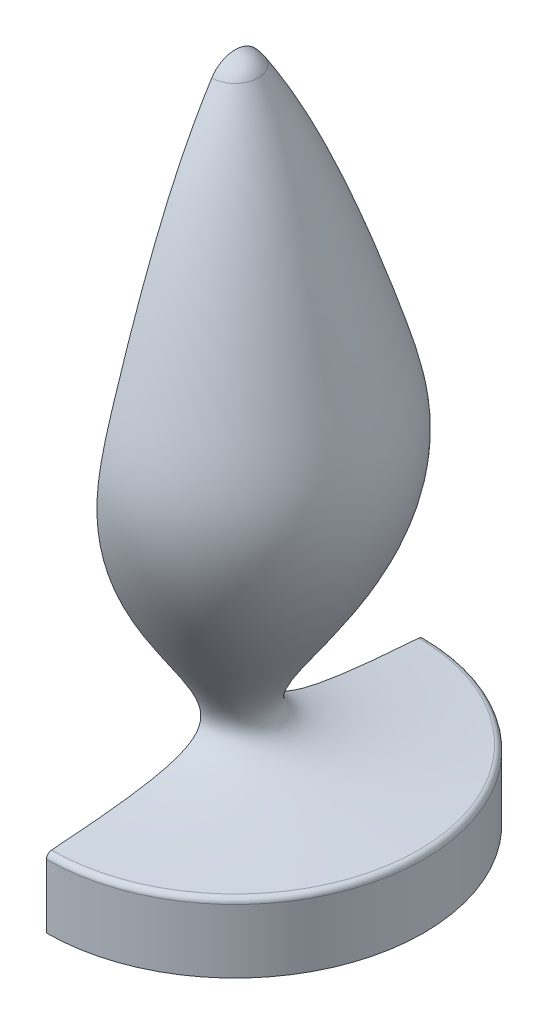
ISO-10303-21;
HEADER;
FILE_DESCRIPTION(('STEP AP214'),'2;1');
FILE_NAME('part.step','',(''),(''),'','','');
FILE_SCHEMA(('AUTOMOTIVE_DESIGN { 1 0 10303 214 1 1 1 1 }'));
ENDSEC;
DATA;
#1=APPLICATION_CONTEXT('core data for automotive mechanical design processes');
#2=APPLICATION_PROTOCOL_DEFINITION('international standard','automotive_design',2000,#1);
#3=PRODUCT_CONTEXT('',#1,'mechanical');
#4=PRODUCT('Part','Part','',(#3));
#5=PRODUCT_RELATED_PRODUCT_CATEGORY('part','',(#4));
#6=PRODUCT_DEFINITION_FORMATION('','',#4);
#7=PRODUCT_DEFINITION_CONTEXT('part definition',#1,'design');
#8=PRODUCT_DEFINITION('design','',#6,#7);
#9=PRODUCT_DEFINITION_SHAPE('','',#8);
#10=(LENGTH_UNIT() NAMED_UNIT(*) SI_UNIT(.MILLI.,.METRE.));
#11=(NAMED_UNIT(*) PLANE_ANGLE_UNIT() SI_UNIT($,.RADIAN.));
#12=(NAMED_UNIT(*) SI_UNIT($,.STERADIAN.) SOLID_ANGLE_UNIT());
#13=UNCERTAINTY_MEASURE_WITH_UNIT(LENGTH_MEASURE(1.E-05),#10,'distance_accuracy_value','');
#14=(GEOMETRIC_REPRESENTATION_CONTEXT(3) GLOBAL_UNCERTAINTY_ASSIGNED_CONTEXT((#13)) GLOBAL_UNIT_ASSIGNED_CONTEXT((#10,
#11,#12)) REPRESENTATION_CONTEXT('',''));
#15=CARTESIAN_POINT('',(0.,0.,0.));
#16=DIRECTION('',(0.,0.,1.));
#17=DIRECTION('',(1.,0.,0.));
#18=AXIS2_PLACEMENT_3D('',#15,#16,#17);
#19=CARTESIAN_POINT('',(17.399,-61.8375846018688,0.));
#20=DIRECTION('',(0.,-1.,0.));
#21=DIRECTION('',(0.,0.,-1.));
#22=AXIS2_PLACEMENT_3D('',#19,#20,#21);
#23=PLANE('',#22);
#24=CARTESIAN_POINT('',(0.,-61.8375846018688,0.));
#25=DIRECTION('',(0.,-1.,0.));
#26=DIRECTION('',(0.,0.,-1.));
#27=AXIS2_PLACEMENT_3D('',#24,#25,#26);
#28=CIRCLE('',#27,17.399);
#29=CARTESIAN_POINT('',(0.,-61.8375846018688,-17.399));
#30=VERTEX_POINT('',#29);
#31=CARTESIAN_POINT('',(0.,-61.8375846018688,17.399));
#32=VERTEX_POINT('',#31);
#33=EDGE_CURVE('E94',#30,#32,#28,.T.);
#34=ORIENTED_EDGE('',*,*,#33,.T.);
#35=DIRECTION('',(0.,0.,-1.));
#36=VECTOR('',#35,1.);
#37=CARTESIAN_POINT('',(0.,-61.8375846018688,0.));
#38=LINE('',#37,#36);
#39=EDGE_CURVE('E96',#32,#30,#38,.T.);
#40=ORIENTED_EDGE('',*,*,#39,.T.);
#41=EDGE_LOOP('',(#34,#40));
#42=FACE_BOUND('',#41,.T.);
#43=ADVANCED_FACE('F41',(#42),#23,.T.);
#44=CARTESIAN_POINT('',(0.,-61.8375846018688,0.));
#45=DIRECTION('',(0.,-1.,0.));
#46=DIRECTION('',(0.,0.,-1.));
#47=AXIS2_PLACEMENT_3D('',#44,#45,#46);
#48=CYLINDRICAL_SURFACE('',#47,17.399);
#49=ORIENTED_EDGE('',*,*,#33,.F.);
#50=DIRECTION('',(0.,-1.,0.));
#51=VECTOR('',#50,1.);
#52=CARTESIAN_POINT('',(0.,-61.8375846018688,-17.399));
#53=LINE('',#52,#51);
#54=CARTESIAN_POINT('',(0.,-55.9617054194878,-17.399));
#55=VERTEX_POINT('',#54);
#56=EDGE_CURVE('E80',#30,#55,#53,.F.);
#57=ORIENTED_EDGE('',*,*,#56,.T.);
#58=CARTESIAN_POINT('',(0.,-55.9617054194878,0.));
#59=DIRECTION('',(0.,1.,0.));
#60=DIRECTION('',(0.,0.,1.));
#61=AXIS2_PLACEMENT_3D('',#58,#59,#60);
#62=CIRCLE('',#61,17.399);
#63=CARTESIAN_POINT('',(0.,-55.9617054194878,17.399));
#64=VERTEX_POINT('',#63);
#65=EDGE_CURVE('E92',#55,#64,#62,.F.);
#66=ORIENTED_EDGE('',*,*,#65,.T.);
#67=DIRECTION('',(0.,-1.,0.));
#68=VECTOR('',#67,1.);
#69=CARTESIAN_POINT('',(0.,-61.8375846018688,17.399));
#70=LINE('',#69,#68);
#71=EDGE_CURVE('E64',#64,#32,#70,.T.);
#72=ORIENTED_EDGE('',*,*,#71,.T.);
#73=EDGE_LOOP('',(#49,#57,#66,#72));
#74=FACE_BOUND('',#73,.T.);
#75=ADVANCED_FACE('F91',(#74),#48,.T.);
#76=CARTESIAN_POINT('',(17.3990000000001,-55.4875846018688,0.));
#77=CARTESIAN_POINT('',(1.07566269527518,-54.3754461381349,0.));
#78=CARTESIAN_POINT('',(1.65024731340701,-51.777325014002,0.));
#79=CARTESIAN_POINT('',(14.7211068867464,-34.2904672299292,0.));
#80=CARTESIAN_POINT('',(8.05336121768823,-12.0212347106612,0.));
#81=CARTESIAN_POINT('',(4.70283696743008,-5.21078677583493,0.));
#82=CARTESIAN_POINT('',(2.14469056079191,-1.1791537932411,0.));
#83=B_SPLINE_CURVE_WITH_KNOTS('',3,(#76,#77,#78,#79,#80,#81,#82),.UNSPECIFIED.,.F.,.F.,(4,1,1,1,
4),(0.105965392109123,0.393281794778003,0.594383744320034,0.655055564842234,1.),.UNSPECIFIED.);
#84=CARTESIAN_POINT('',(0.,-61.8375846018688,0.));
#85=DIRECTION('',(0.,-1.,0.));
#86=AXIS1_PLACEMENT('',#84,#85);
#87=SURFACE_OF_REVOLUTION('',#83,#86);
#88=CARTESIAN_POINT('',(0.,-55.4549469010155,0.));
#89=DIRECTION('',(0.,-1.,0.));
#90=DIRECTION('',(0.,0.,-1.));
#91=AXIS2_PLACEMENT_3D('',#88,#89,#90);
#92=CIRCLE('',#91,16.926493717131);
#93=CARTESIAN_POINT('',(0.,-55.4549469010162,16.9264937171398));
#94=VERTEX_POINT('',#93);
#95=CARTESIAN_POINT('',(0.,-55.4549469010155,-16.926493717131));
#96=VERTEX_POINT('',#95);
#97=EDGE_CURVE('E87',#94,#96,#92,.F.);
#98=ORIENTED_EDGE('',*,*,#97,.T.);
#99=CARTESIAN_POINT('',(0.,-55.4875846018688,-17.3990000000001));
#100=CARTESIAN_POINT('',(0.,-54.3754461381349,-1.07566269527518));
#101=CARTESIAN_POINT('',(0.,-51.777325014002,-1.65024731340701));
#102=CARTESIAN_POINT('',(0.,-34.2904672299292,-14.7211068867464));
#103=CARTESIAN_POINT('',(0.,-12.0212347106612,-8.05336121768823));
#104=CARTESIAN_POINT('',(0.,-5.21078677583493,-4.70283696743008));
#105=CARTESIAN_POINT('',(0.,-1.1791537932411,-2.14469056079191));
#106=B_SPLINE_CURVE_WITH_KNOTS('',3,(#99,#100,#101,#102,#103,#104,#105),.UNSPECIFIED.,.F.,.F.,
(4,1,1,1,4),(0.105965392109123,0.393281794778003,0.594383744320034,0.655055564842234,1.),.UNSPECIFIED.);
#107=CARTESIAN_POINT('',(0.,-1.1791537932411,-2.14469056079191));
#108=VERTEX_POINT('',#107);
#109=EDGE_CURVE('E57',#96,#108,#106,.T.);
#110=ORIENTED_EDGE('',*,*,#109,.T.);
#111=CARTESIAN_POINT('',(0.,-1.1791537932411,0.));
#112=DIRECTION('',(0.,-1.,0.));
#113=DIRECTION('',(0.,0.,-1.));
#114=AXIS2_PLACEMENT_3D('',#111,#112,#113);
#115=CIRCLE('',#114,2.14469056079191);
#116=CARTESIAN_POINT('',(0.,-1.1791537932411,2.14469056079191));
#117=VERTEX_POINT('',#116);
#118=EDGE_CURVE('E103',#108,#117,#115,.T.);
#119=ORIENTED_EDGE('',*,*,#118,.T.);
#120=CARTESIAN_POINT('',(0.,-55.4875846018688,17.3990000000001));
#121=CARTESIAN_POINT('',(0.,-54.3754461381349,1.07566269527518));
#122=CARTESIAN_POINT('',(0.,-51.777325014002,1.65024731340701));
#123=CARTESIAN_POINT('',(0.,-34.2904672299292,14.7211068867464));
#124=CARTESIAN_POINT('',(0.,-12.0212347106612,8.05336121768823));
#125=CARTESIAN_POINT('',(0.,-5.21078677583493,4.70283696743008));
#126=CARTESIAN_POINT('',(0.,-1.1791537932411,2.14469056079191));
#127=B_SPLINE_CURVE_WITH_KNOTS('',3,(#120,#121,#122,#123,#124,#125,#126),.UNSPECIFIED.,.F.,.F.,
(4,1,1,1,4),(0.105965392109123,0.393281794778003,0.594383744320034,0.655055564842234,1.),.UNSPECIFIED.);
#128=EDGE_CURVE('E135',#117,#94,#127,.F.);
#129=ORIENTED_EDGE('',*,*,#128,.T.);
#130=EDGE_LOOP('',(#98,#110,#119,#129));
#131=FACE_BOUND('',#130,.T.);
#132=ADVANCED_FACE('F118',(#131),#87,.F.);
#133=CARTESIAN_POINT('',(0.,-2.54,0.));
#134=DIRECTION('',(0.,-1.,0.));
#135=DIRECTION('',(1.,0.,0.));
#136=AXIS2_PLACEMENT_3D('',#133,#134,#135);
#137=SPHERICAL_SURFACE('',#136,2.54);
#138=ORIENTED_EDGE('',*,*,#118,.F.);
#139=CARTESIAN_POINT('',(0.,-2.54,0.));
#140=DIRECTION('',(-1.,0.,0.));
#141=DIRECTION('',(0.,-1.,0.));
#142=AXIS2_PLACEMENT_3D('',#139,#140,#141);
#143=CIRCLE('',#142,2.54);
#144=EDGE_CURVE('E131',#108,#117,#143,.F.);
#145=ORIENTED_EDGE('',*,*,#144,.T.);
#146=EDGE_LOOP('',(#138,#145));
#147=FACE_BOUND('',#146,.T.);
#148=ADVANCED_FACE('F122',(#147),#137,.T.);
#149=CARTESIAN_POINT('',(0.,-55.9617054194878,0.));
#150=DIRECTION('',(0.,1.,0.));
#151=DIRECTION('',(0.,0.,1.));
#152=AXIS2_PLACEMENT_3D('',#149,#150,#151);
#153=TOROIDAL_SURFACE('',#152,16.891,0.508);
#154=ORIENTED_EDGE('',*,*,#97,.F.);
#155=CARTESIAN_POINT('',(0.,-55.9617054194878,16.891));
#156=DIRECTION('',(-1.,0.,0.));
#157=DIRECTION('',(0.,-1.,0.));
#158=AXIS2_PLACEMENT_3D('',#155,#156,#157);
#159=CIRCLE('',#158,0.508);
#160=EDGE_CURVE('E11',#94,#64,#159,.F.);
#161=ORIENTED_EDGE('',*,*,#160,.T.);
#162=ORIENTED_EDGE('',*,*,#65,.F.);
#163=CARTESIAN_POINT('',(0.,-55.9617054194878,-16.891));
#164=DIRECTION('',(-1.,0.,0.));
#165=DIRECTION('',(0.,-1.,0.));
#166=AXIS2_PLACEMENT_3D('',#163,#164,#165);
#167=CIRCLE('',#166,0.508);
#168=EDGE_CURVE('E50',#55,#96,#167,.F.);
#169=ORIENTED_EDGE('',*,*,#168,.T.);
#170=EDGE_LOOP('',(#154,#161,#162,#169));
#171=FACE_BOUND('',#170,.T.);
#172=ADVANCED_FACE('F43',(#171),#153,.T.);
#173=CARTESIAN_POINT('',(0.,97.851998641352,25.4));
#174=DIRECTION('',(-1.,0.,0.));
#175=DIRECTION('',(0.,-1.,0.));
#176=AXIS2_PLACEMENT_3D('',#173,#174,#175);
#177=PLANE('',#176);
#178=ORIENTED_EDGE('',*,*,#128,.F.);
#179=ORIENTED_EDGE('',*,*,#144,.F.);
#180=ORIENTED_EDGE('',*,*,#109,.F.);
#181=ORIENTED_EDGE('',*,*,#168,.F.);
#182=ORIENTED_EDGE('',*,*,#56,.F.);
#183=ORIENTED_EDGE('',*,*,#39,.F.);
#184=ORIENTED_EDGE('',*,*,#71,.F.);
#185=ORIENTED_EDGE('',*,*,#160,.F.);
#186=EDGE_LOOP('',(#178,#179,#180,#181,#182,#183,#184,#185));
#187=FACE_BOUND('',#186,.T.);
#188=ADVANCED_FACE('F79',(#187),#177,.T.);
#189=CLOSED_SHELL('',(#43,#75,#132,#148,#172,#188));
#190=MANIFOLD_SOLID_BREP('B2',#189);
#191=ADVANCED_BREP_SHAPE_REPRESENTATION('',(#18,#190),#14);
#192=SHAPE_DEFINITION_REPRESENTATION(#9,#191);
ENDSEC;
END-ISO-10303-21;
